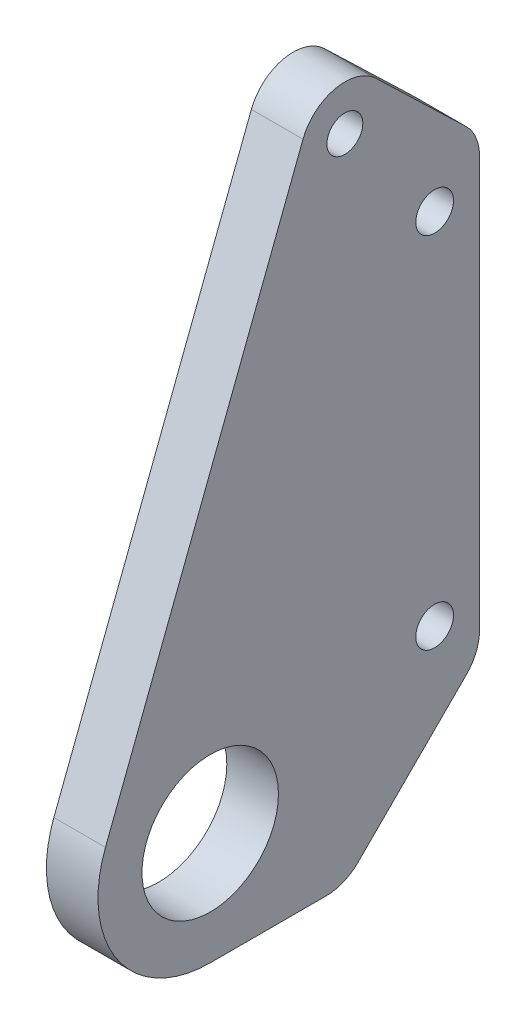
ISO-10303-21;
HEADER;
FILE_DESCRIPTION(('STEP AP214'),'2;1');
FILE_NAME('part.step','',(''),(''),'','','');
FILE_SCHEMA(('AUTOMOTIVE_DESIGN { 1 0 10303 214 1 1 1 1 }'));
ENDSEC;
DATA;
#1=APPLICATION_CONTEXT('core data for automotive mechanical design processes');
#2=APPLICATION_PROTOCOL_DEFINITION('international standard','automotive_design',2000,#1);
#3=PRODUCT_CONTEXT('',#1,'mechanical');
#4=PRODUCT('Part','Part','',(#3));
#5=PRODUCT_RELATED_PRODUCT_CATEGORY('part','',(#4));
#6=PRODUCT_DEFINITION_FORMATION('','',#4);
#7=PRODUCT_DEFINITION_CONTEXT('part definition',#1,'design');
#8=PRODUCT_DEFINITION('design','',#6,#7);
#9=PRODUCT_DEFINITION_SHAPE('','',#8);
#10=(LENGTH_UNIT() NAMED_UNIT(*) SI_UNIT(.MILLI.,.METRE.));
#11=(NAMED_UNIT(*) PLANE_ANGLE_UNIT() SI_UNIT($,.RADIAN.));
#12=(NAMED_UNIT(*) SI_UNIT($,.STERADIAN.) SOLID_ANGLE_UNIT());
#13=UNCERTAINTY_MEASURE_WITH_UNIT(LENGTH_MEASURE(1.E-05),#10,'distance_accuracy_value','');
#14=(GEOMETRIC_REPRESENTATION_CONTEXT(3) GLOBAL_UNCERTAINTY_ASSIGNED_CONTEXT((#13)) GLOBAL_UNIT_ASSIGNED_CONTEXT((#10,
#11,#12)) REPRESENTATION_CONTEXT('',''));
#15=CARTESIAN_POINT('',(0.,0.,0.));
#16=DIRECTION('',(0.,0.,1.));
#17=DIRECTION('',(1.,0.,0.));
#18=AXIS2_PLACEMENT_3D('',#15,#16,#17);
#19=CARTESIAN_POINT('',(5.75,33.7350017623774,-32.4765264559947));
#20=DIRECTION('',(0.,-0.720416564991047,0.693541615828856));
#21=DIRECTION('',(0.,-0.693541615828856,-0.720416564991047));
#22=AXIS2_PLACEMENT_3D('',#19,#20,#21);
#23=PLANE('',#22);
#24=DIRECTION('',(0.,0.693541615828856,0.720416564991047));
#25=VECTOR('',#24,1.);
#26=CARTESIAN_POINT('',(5.75,33.7350017623774,-32.4765264559947));
#27=LINE('',#26,#25);
#28=CARTESIAN_POINT('',(5.75,66.4751301765597,1.53229192085572));
#29=VERTEX_POINT('',#28);
#30=CARTESIAN_POINT('',(5.75,76.1020828249552,11.5322919208557));
#31=VERTEX_POINT('',#30);
#32=EDGE_CURVE('E114',#29,#31,#27,.T.);
#33=ORIENTED_EDGE('',*,*,#32,.F.);
#34=DIRECTION('',(-1.,0.,0.));
#35=VECTOR('',#34,1.);
#36=CARTESIAN_POINT('',(5.75,66.4751301765597,1.53229192085572));
#37=LINE('',#36,#35);
#38=CARTESIAN_POINT('',(0.,66.4751301765597,1.53229192085572));
#39=VERTEX_POINT('',#38);
#40=EDGE_CURVE('E11',#29,#39,#37,.T.);
#41=ORIENTED_EDGE('',*,*,#40,.T.);
#42=DIRECTION('',(0.,0.693541615828856,0.720416564991047));
#43=VECTOR('',#42,1.);
#44=CARTESIAN_POINT('',(0.,33.7350017623774,-32.4765264559947));
#45=LINE('',#44,#43);
#46=CARTESIAN_POINT('',(0.,76.1020828249552,11.5322919208557));
#47=VERTEX_POINT('',#46);
#48=EDGE_CURVE('E138',#39,#47,#45,.T.);
#49=ORIENTED_EDGE('',*,*,#48,.T.);
#50=DIRECTION('',(-1.,0.,0.));
#51=VECTOR('',#50,1.);
#52=CARTESIAN_POINT('',(5.75,76.1020828249552,11.5322919208557));
#53=LINE('',#52,#51);
#54=EDGE_CURVE('E131',#31,#47,#53,.T.);
#55=ORIENTED_EDGE('',*,*,#54,.F.);
#56=EDGE_LOOP('',(#33,#41,#49,#55));
#57=FACE_BOUND('',#56,.T.);
#58=ADVANCED_FACE('F37',(#57),#23,.F.);
#59=CARTESIAN_POINT('',(5.75,72.5,15.));
#60=DIRECTION('',(-1.,0.,0.));
#61=DIRECTION('',(0.,0.,1.));
#62=AXIS2_PLACEMENT_3D('',#59,#60,#61);
#63=CYLINDRICAL_SURFACE('',#62,5.);
#64=CARTESIAN_POINT('',(0.,72.5,15.));
#65=DIRECTION('',(1.,0.,0.));
#66=DIRECTION('',(0.,0.,-1.));
#67=AXIS2_PLACEMENT_3D('',#64,#65,#66);
#68=CIRCLE('',#67,5.);
#69=CARTESIAN_POINT('',(0.,74.2919636429224,19.6678545716897));
#70=VERTEX_POINT('',#69);
#71=EDGE_CURVE('E209',#47,#70,#68,.T.);
#72=ORIENTED_EDGE('',*,*,#71,.T.);
#73=DIRECTION('',(-1.,0.,0.));
#74=VECTOR('',#73,1.);
#75=CARTESIAN_POINT('',(5.75,74.2919636429224,19.6678545716897));
#76=LINE('',#75,#74);
#77=CARTESIAN_POINT('',(5.75,74.2919636429224,19.6678545716897));
#78=VERTEX_POINT('',#77);
#79=EDGE_CURVE('E133',#78,#70,#76,.T.);
#80=ORIENTED_EDGE('',*,*,#79,.F.);
#81=CARTESIAN_POINT('',(5.75,72.5,15.));
#82=DIRECTION('',(1.,0.,0.));
#83=DIRECTION('',(0.,0.,-1.));
#84=AXIS2_PLACEMENT_3D('',#81,#82,#83);
#85=CIRCLE('',#84,5.);
#86=EDGE_CURVE('E119',#31,#78,#85,.T.);
#87=ORIENTED_EDGE('',*,*,#86,.F.);
#88=ORIENTED_EDGE('',*,*,#54,.T.);
#89=EDGE_LOOP('',(#72,#80,#87,#88));
#90=FACE_BOUND('',#89,.T.);
#91=ADVANCED_FACE('F130',(#90),#63,.T.);
#92=CARTESIAN_POINT('',(5.75,16.1230267755844,41.9985888336158));
#93=DIRECTION('',(0.,-0.358392728584483,-0.933570914337935));
#94=DIRECTION('',(0.,0.933570914337935,-0.358392728584483));
#95=AXIS2_PLACEMENT_3D('',#92,#93,#94);
#96=PLANE('',#95);
#97=DIRECTION('',(0.,-0.933570914337935,0.358392728584484));
#98=VECTOR('',#97,1.);
#99=CARTESIAN_POINT('',(0.,16.1230267755844,41.9985888336158));
#100=LINE('',#99,#98);
#101=CARTESIAN_POINT('',(0.,16.979909107306,41.6696364292242));
#102=VERTEX_POINT('',#101);
#103=EDGE_CURVE('E206',#70,#102,#100,.T.);
#104=ORIENTED_EDGE('',*,*,#103,.T.);
#105=DIRECTION('',(-1.,0.,0.));
#106=VECTOR('',#105,1.);
#107=CARTESIAN_POINT('',(5.75,16.979909107306,41.6696364292242));
#108=LINE('',#107,#106);
#109=CARTESIAN_POINT('',(5.75,16.979909107306,41.6696364292242));
#110=VERTEX_POINT('',#109);
#111=EDGE_CURVE('E144',#110,#102,#108,.T.);
#112=ORIENTED_EDGE('',*,*,#111,.F.);
#113=DIRECTION('',(0.,-0.933570914337935,0.358392728584484));
#114=VECTOR('',#113,1.);
#115=CARTESIAN_POINT('',(5.75,16.1230267755844,41.9985888336158));
#116=LINE('',#115,#114);
#117=EDGE_CURVE('E135',#78,#110,#116,.T.);
#118=ORIENTED_EDGE('',*,*,#117,.F.);
#119=ORIENTED_EDGE('',*,*,#79,.T.);
#120=EDGE_LOOP('',(#104,#112,#118,#119));
#121=FACE_BOUND('',#120,.T.);
#122=ADVANCED_FACE('F232',(#121),#96,.F.);
#123=CARTESIAN_POINT('',(5.75,12.5,30.));
#124=DIRECTION('',(-1.,0.,0.));
#125=DIRECTION('',(0.,0.,1.));
#126=AXIS2_PLACEMENT_3D('',#123,#124,#125);
#127=CYLINDRICAL_SURFACE('',#126,12.5);
#128=CARTESIAN_POINT('',(0.,12.5,30.));
#129=DIRECTION('',(1.,0.,0.));
#130=DIRECTION('',(0.,0.,-1.));
#131=AXIS2_PLACEMENT_3D('',#128,#129,#130);
#132=CIRCLE('',#131,12.5);
#133=CARTESIAN_POINT('',(0.,0.,30.));
#134=VERTEX_POINT('',#133);
#135=EDGE_CURVE('E201',#102,#134,#132,.T.);
#136=ORIENTED_EDGE('',*,*,#135,.T.);
#137=DIRECTION('',(-1.,0.,0.));
#138=VECTOR('',#137,1.);
#139=CARTESIAN_POINT('',(5.75,0.,30.));
#140=LINE('',#139,#138);
#141=CARTESIAN_POINT('',(5.75,0.,30.));
#142=VERTEX_POINT('',#141);
#143=EDGE_CURVE('E191',#142,#134,#140,.T.);
#144=ORIENTED_EDGE('',*,*,#143,.F.);
#145=CARTESIAN_POINT('',(5.75,12.5,30.));
#146=DIRECTION('',(1.,0.,0.));
#147=DIRECTION('',(0.,0.,-1.));
#148=AXIS2_PLACEMENT_3D('',#145,#146,#147);
#149=CIRCLE('',#148,12.5);
#150=EDGE_CURVE('E202',#110,#142,#149,.T.);
#151=ORIENTED_EDGE('',*,*,#150,.F.);
#152=ORIENTED_EDGE('',*,*,#111,.T.);
#153=EDGE_LOOP('',(#136,#144,#151,#152));
#154=FACE_BOUND('',#153,.T.);
#155=ADVANCED_FACE('F199',(#154),#127,.T.);
#156=CARTESIAN_POINT('',(5.75,0.,0.));
#157=DIRECTION('',(0.,1.,0.));
#158=DIRECTION('',(0.,0.,1.));
#159=AXIS2_PLACEMENT_3D('',#156,#157,#158);
#160=PLANE('',#159);
#161=DIRECTION('',(0.,0.,-1.));
#162=VECTOR('',#161,1.);
#163=CARTESIAN_POINT('',(0.,0.,0.));
#164=LINE('',#163,#162);
#165=CARTESIAN_POINT('',(0.,0.,17.0710678118656));
#166=VERTEX_POINT('',#165);
#167=EDGE_CURVE('E180',#134,#166,#164,.T.);
#168=ORIENTED_EDGE('',*,*,#167,.T.);
#169=DIRECTION('',(-1.,0.,0.));
#170=VECTOR('',#169,1.);
#171=CARTESIAN_POINT('',(5.75,0.,17.0710678118656));
#172=LINE('',#171,#170);
#173=CARTESIAN_POINT('',(5.75,0.,17.0710678118656));
#174=VERTEX_POINT('',#173);
#175=EDGE_CURVE('E156',#166,#174,#172,.F.);
#176=ORIENTED_EDGE('',*,*,#175,.T.);
#177=DIRECTION('',(0.,0.,-1.));
#178=VECTOR('',#177,1.);
#179=CARTESIAN_POINT('',(5.75,0.,0.));
#180=LINE('',#179,#178);
#181=EDGE_CURVE('E229',#142,#174,#180,.T.);
#182=ORIENTED_EDGE('',*,*,#181,.F.);
#183=ORIENTED_EDGE('',*,*,#143,.T.);
#184=EDGE_LOOP('',(#168,#176,#182,#183));
#185=FACE_BOUND('',#184,.T.);
#186=ADVANCED_FACE('F239',(#185),#160,.F.);
#187=CARTESIAN_POINT('',(5.75,7.50000000000008,7.5));
#188=DIRECTION('',(0.,-0.707106781186551,-0.707106781186544));
#189=DIRECTION('',(0.,0.707106781186544,-0.707106781186551));
#190=AXIS2_PLACEMENT_3D('',#187,#188,#189);
#191=PLANE('',#190);
#192=DIRECTION('',(0.,-0.707106781186544,0.707106781186551));
#193=VECTOR('',#192,1.);
#194=CARTESIAN_POINT('',(5.75,7.50000000000008,7.5));
#195=LINE('',#194,#193);
#196=CARTESIAN_POINT('',(5.75,13.5355339059327,1.46446609406728));
#197=VERTEX_POINT('',#196);
#198=CARTESIAN_POINT('',(5.75,1.46446609406724,13.5355339059329));
#199=VERTEX_POINT('',#198);
#200=EDGE_CURVE('E226',#197,#199,#195,.T.);
#201=ORIENTED_EDGE('',*,*,#200,.T.);
#202=DIRECTION('',(-1.,0.,0.));
#203=VECTOR('',#202,1.);
#204=CARTESIAN_POINT('',(0.,1.46446609406724,13.5355339059329));
#205=LINE('',#204,#203);
#206=CARTESIAN_POINT('',(0.,1.46446609406724,13.5355339059329));
#207=VERTEX_POINT('',#206);
#208=EDGE_CURVE('E142',#199,#207,#205,.T.);
#209=ORIENTED_EDGE('',*,*,#208,.T.);
#210=DIRECTION('',(0.,-0.707106781186544,0.707106781186551));
#211=VECTOR('',#210,1.);
#212=CARTESIAN_POINT('',(0.,7.50000000000008,7.5));
#213=LINE('',#212,#211);
#214=CARTESIAN_POINT('',(0.,13.5355339059327,1.46446609406728));
#215=VERTEX_POINT('',#214);
#216=EDGE_CURVE('E175',#215,#207,#213,.T.);
#217=ORIENTED_EDGE('',*,*,#216,.F.);
#218=DIRECTION('',(-1.,0.,0.));
#219=VECTOR('',#218,1.);
#220=CARTESIAN_POINT('',(5.75,13.5355339059327,1.46446609406728));
#221=LINE('',#220,#219);
#222=EDGE_CURVE('E140',#215,#197,#221,.F.);
#223=ORIENTED_EDGE('',*,*,#222,.T.);
#224=EDGE_LOOP('',(#201,#209,#217,#223));
#225=FACE_BOUND('',#224,.T.);
#226=ADVANCED_FACE('F258',(#225),#191,.T.);
#227=CARTESIAN_POINT('',(5.75,20.,5.));
#228=DIRECTION('',(-1.,0.,0.));
#229=DIRECTION('',(0.,0.,1.));
#230=AXIS2_PLACEMENT_3D('',#227,#228,#229);
#231=CYLINDRICAL_SURFACE('',#230,2.1);
#232=CARTESIAN_POINT('',(5.75,20.,5.));
#233=DIRECTION('',(1.,0.,0.));
#234=DIRECTION('',(0.,0.,-1.));
#235=AXIS2_PLACEMENT_3D('',#232,#233,#234);
#236=CIRCLE('',#235,2.1);
#237=CARTESIAN_POINT('',(5.75,20.,2.9));
#238=VERTEX_POINT('',#237);
#239=EDGE_CURVE('E216',#238,#238,#236,.T.);
#240=ORIENTED_EDGE('',*,*,#239,.T.);
#241=EDGE_LOOP('',(#240));
#242=FACE_BOUND('',#241,.T.);
#243=CARTESIAN_POINT('',(0.,20.,5.));
#244=DIRECTION('',(1.,0.,0.));
#245=DIRECTION('',(0.,0.,-1.));
#246=AXIS2_PLACEMENT_3D('',#243,#244,#245);
#247=CIRCLE('',#246,2.1);
#248=CARTESIAN_POINT('',(0.,20.,2.9));
#249=VERTEX_POINT('',#248);
#250=EDGE_CURVE('E186',#249,#249,#247,.T.);
#251=ORIENTED_EDGE('',*,*,#250,.F.);
#252=EDGE_LOOP('',(#251));
#253=FACE_BOUND('',#252,.T.);
#254=ADVANCED_FACE('F269',(#242,#253),#231,.F.);
#255=CARTESIAN_POINT('',(5.75,60.,5.));
#256=DIRECTION('',(-1.,0.,0.));
#257=DIRECTION('',(0.,0.,1.));
#258=AXIS2_PLACEMENT_3D('',#255,#256,#257);
#259=CYLINDRICAL_SURFACE('',#258,2.1);
#260=CARTESIAN_POINT('',(5.75,60.,5.));
#261=DIRECTION('',(1.,0.,0.));
#262=DIRECTION('',(0.,0.,-1.));
#263=AXIS2_PLACEMENT_3D('',#260,#261,#262);
#264=CIRCLE('',#263,2.1);
#265=CARTESIAN_POINT('',(5.75,60.,2.90000000000001));
#266=VERTEX_POINT('',#265);
#267=EDGE_CURVE('E219',#266,#266,#264,.T.);
#268=ORIENTED_EDGE('',*,*,#267,.T.);
#269=EDGE_LOOP('',(#268));
#270=FACE_BOUND('',#269,.T.);
#271=CARTESIAN_POINT('',(0.,60.,5.));
#272=DIRECTION('',(1.,0.,0.));
#273=DIRECTION('',(0.,0.,-1.));
#274=AXIS2_PLACEMENT_3D('',#271,#272,#273);
#275=CIRCLE('',#274,2.1);
#276=CARTESIAN_POINT('',(0.,60.,2.90000000000001));
#277=VERTEX_POINT('',#276);
#278=EDGE_CURVE('E178',#277,#277,#275,.T.);
#279=ORIENTED_EDGE('',*,*,#278,.F.);
#280=EDGE_LOOP('',(#279));
#281=FACE_BOUND('',#280,.T.);
#282=ADVANCED_FACE('F278',(#270,#281),#259,.F.);
#283=CARTESIAN_POINT('',(5.75,12.5,30.));
#284=DIRECTION('',(-1.,0.,0.));
#285=DIRECTION('',(0.,0.,1.));
#286=AXIS2_PLACEMENT_3D('',#283,#284,#285);
#287=CYLINDRICAL_SURFACE('',#286,7.59999999999999);
#288=CARTESIAN_POINT('',(5.75,12.5,30.));
#289=DIRECTION('',(1.,0.,0.));
#290=DIRECTION('',(0.,0.,-1.));
#291=AXIS2_PLACEMENT_3D('',#288,#289,#290);
#292=CIRCLE('',#291,7.59999999999999);
#293=CARTESIAN_POINT('',(5.75,12.5,22.4));
#294=VERTEX_POINT('',#293);
#295=EDGE_CURVE('E222',#294,#294,#292,.T.);
#296=ORIENTED_EDGE('',*,*,#295,.T.);
#297=EDGE_LOOP('',(#296));
#298=FACE_BOUND('',#297,.T.);
#299=CARTESIAN_POINT('',(0.,12.5,30.));
#300=DIRECTION('',(1.,0.,0.));
#301=DIRECTION('',(0.,0.,-1.));
#302=AXIS2_PLACEMENT_3D('',#299,#300,#301);
#303=CIRCLE('',#302,7.59999999999999);
#304=CARTESIAN_POINT('',(0.,12.5,22.4));
#305=VERTEX_POINT('',#304);
#306=EDGE_CURVE('E174',#305,#305,#303,.T.);
#307=ORIENTED_EDGE('',*,*,#306,.F.);
#308=EDGE_LOOP('',(#307));
#309=FACE_BOUND('',#308,.T.);
#310=ADVANCED_FACE('F275',(#298,#309),#287,.F.);
#311=CARTESIAN_POINT('',(5.75,0.,0.));
#312=DIRECTION('',(0.,0.,1.));
#313=DIRECTION('',(0.,-1.,0.));
#314=AXIS2_PLACEMENT_3D('',#311,#312,#313);
#315=PLANE('',#314);
#316=DIRECTION('',(0.,1.,0.));
#317=VECTOR('',#316,1.);
#318=CARTESIAN_POINT('',(5.75,0.,0.));
#319=LINE('',#318,#317);
#320=CARTESIAN_POINT('',(5.75,17.0710678118655,0.));
#321=VERTEX_POINT('',#320);
#322=CARTESIAN_POINT('',(5.75,62.8730473516045,0.));
#323=VERTEX_POINT('',#322);
#324=EDGE_CURVE('E167',#321,#323,#319,.T.);
#325=ORIENTED_EDGE('',*,*,#324,.F.);
#326=DIRECTION('',(-1.,0.,0.));
#327=VECTOR('',#326,1.);
#328=CARTESIAN_POINT('',(0.,17.0710678118655,0.));
#329=LINE('',#328,#327);
#330=CARTESIAN_POINT('',(0.,17.0710678118655,0.));
#331=VERTEX_POINT('',#330);
#332=EDGE_CURVE('E45',#321,#331,#329,.T.);
#333=ORIENTED_EDGE('',*,*,#332,.T.);
#334=DIRECTION('',(0.,1.,0.));
#335=VECTOR('',#334,1.);
#336=CARTESIAN_POINT('',(0.,0.,0.));
#337=LINE('',#336,#335);
#338=CARTESIAN_POINT('',(0.,62.8730473516045,0.));
#339=VERTEX_POINT('',#338);
#340=EDGE_CURVE('E166',#331,#339,#337,.T.);
#341=ORIENTED_EDGE('',*,*,#340,.T.);
#342=DIRECTION('',(-1.,0.,0.));
#343=VECTOR('',#342,1.);
#344=CARTESIAN_POINT('',(5.75,62.8730473516045,0.));
#345=LINE('',#344,#343);
#346=EDGE_CURVE('E52',#339,#323,#345,.F.);
#347=ORIENTED_EDGE('',*,*,#346,.T.);
#348=EDGE_LOOP('',(#325,#333,#341,#347));
#349=FACE_BOUND('',#348,.T.);
#350=ADVANCED_FACE('F165',(#349),#315,.F.);
#351=CARTESIAN_POINT('',(5.75,72.5,15.));
#352=DIRECTION('',(-1.,0.,0.));
#353=DIRECTION('',(0.,0.,1.));
#354=AXIS2_PLACEMENT_3D('',#351,#352,#353);
#355=CYLINDRICAL_SURFACE('',#354,2.);
#356=CARTESIAN_POINT('',(5.75,72.5,15.));
#357=DIRECTION('',(1.,0.,0.));
#358=DIRECTION('',(0.,0.,-1.));
#359=AXIS2_PLACEMENT_3D('',#356,#357,#358);
#360=CIRCLE('',#359,2.);
#361=CARTESIAN_POINT('',(5.75,72.5,13.));
#362=VERTEX_POINT('',#361);
#363=EDGE_CURVE('E193',#362,#362,#360,.T.);
#364=ORIENTED_EDGE('',*,*,#363,.T.);
#365=EDGE_LOOP('',(#364));
#366=FACE_BOUND('',#365,.T.);
#367=CARTESIAN_POINT('',(0.,72.5,15.));
#368=DIRECTION('',(1.,0.,0.));
#369=DIRECTION('',(0.,0.,-1.));
#370=AXIS2_PLACEMENT_3D('',#367,#368,#369);
#371=CIRCLE('',#370,2.);
#372=CARTESIAN_POINT('',(0.,72.5,13.));
#373=VERTEX_POINT('',#372);
#374=EDGE_CURVE('E126',#373,#373,#371,.T.);
#375=ORIENTED_EDGE('',*,*,#374,.F.);
#376=EDGE_LOOP('',(#375));
#377=FACE_BOUND('',#376,.T.);
#378=ADVANCED_FACE('F274',(#366,#377),#355,.F.);
#379=CARTESIAN_POINT('',(5.75,0.,0.));
#380=DIRECTION('',(1.,0.,0.));
#381=DIRECTION('',(0.,0.,-1.));
#382=AXIS2_PLACEMENT_3D('',#379,#380,#381);
#383=PLANE('',#382);
#384=ORIENTED_EDGE('',*,*,#181,.T.);
#385=CARTESIAN_POINT('',(5.75,5.,17.0710678118656));
#386=DIRECTION('',(1.,0.,0.));
#387=DIRECTION('',(0.,0.,-1.));
#388=AXIS2_PLACEMENT_3D('',#385,#386,#387);
#389=CIRCLE('',#388,5.);
#390=EDGE_CURVE('E160',#174,#199,#389,.T.);
#391=ORIENTED_EDGE('',*,*,#390,.T.);
#392=ORIENTED_EDGE('',*,*,#200,.F.);
#393=CARTESIAN_POINT('',(5.75,17.0710678118655,5.));
#394=DIRECTION('',(1.,0.,0.));
#395=DIRECTION('',(0.,0.,-1.));
#396=AXIS2_PLACEMENT_3D('',#393,#394,#395);
#397=CIRCLE('',#396,5.);
#398=EDGE_CURVE('E59',#197,#321,#397,.T.);
#399=ORIENTED_EDGE('',*,*,#398,.T.);
#400=ORIENTED_EDGE('',*,*,#324,.T.);
#401=CARTESIAN_POINT('',(5.75,62.8730473516045,5.));
#402=DIRECTION('',(1.,0.,0.));
#403=DIRECTION('',(0.,0.,-1.));
#404=AXIS2_PLACEMENT_3D('',#401,#402,#403);
#405=CIRCLE('',#404,5.);
#406=EDGE_CURVE('E122',#323,#29,#405,.T.);
#407=ORIENTED_EDGE('',*,*,#406,.T.);
#408=ORIENTED_EDGE('',*,*,#32,.T.);
#409=ORIENTED_EDGE('',*,*,#86,.T.);
#410=ORIENTED_EDGE('',*,*,#117,.T.);
#411=ORIENTED_EDGE('',*,*,#150,.T.);
#412=EDGE_LOOP('',(#384,#391,#392,#399,#400,#407,#408,#409,#410,#411));
#413=FACE_BOUND('',#412,.T.);
#414=ORIENTED_EDGE('',*,*,#295,.F.);
#415=EDGE_LOOP('',(#414));
#416=FACE_BOUND('',#415,.T.);
#417=ORIENTED_EDGE('',*,*,#267,.F.);
#418=EDGE_LOOP('',(#417));
#419=FACE_BOUND('',#418,.T.);
#420=ORIENTED_EDGE('',*,*,#239,.F.);
#421=EDGE_LOOP('',(#420));
#422=FACE_BOUND('',#421,.T.);
#423=ORIENTED_EDGE('',*,*,#363,.F.);
#424=EDGE_LOOP('',(#423));
#425=FACE_BOUND('',#424,.T.);
#426=ADVANCED_FACE('F117',(#413,#416,#419,#422,#425),#383,.T.);
#427=CARTESIAN_POINT('',(0.,0.,0.));
#428=DIRECTION('',(1.,0.,0.));
#429=DIRECTION('',(0.,0.,-1.));
#430=AXIS2_PLACEMENT_3D('',#427,#428,#429);
#431=PLANE('',#430);
#432=ORIENTED_EDGE('',*,*,#216,.T.);
#433=CARTESIAN_POINT('',(0.,5.,17.0710678118656));
#434=DIRECTION('',(1.,0.,0.));
#435=DIRECTION('',(0.,0.,-1.));
#436=AXIS2_PLACEMENT_3D('',#433,#434,#435);
#437=CIRCLE('',#436,5.);
#438=EDGE_CURVE('E154',#207,#166,#437,.F.);
#439=ORIENTED_EDGE('',*,*,#438,.T.);
#440=ORIENTED_EDGE('',*,*,#167,.F.);
#441=ORIENTED_EDGE('',*,*,#135,.F.);
#442=ORIENTED_EDGE('',*,*,#103,.F.);
#443=ORIENTED_EDGE('',*,*,#71,.F.);
#444=ORIENTED_EDGE('',*,*,#48,.F.);
#445=CARTESIAN_POINT('',(0.,62.8730473516045,5.));
#446=DIRECTION('',(1.,0.,0.));
#447=DIRECTION('',(0.,0.,-1.));
#448=AXIS2_PLACEMENT_3D('',#445,#446,#447);
#449=CIRCLE('',#448,5.);
#450=EDGE_CURVE('E150',#39,#339,#449,.F.);
#451=ORIENTED_EDGE('',*,*,#450,.T.);
#452=ORIENTED_EDGE('',*,*,#340,.F.);
#453=CARTESIAN_POINT('',(0.,17.0710678118655,5.));
#454=DIRECTION('',(1.,0.,0.));
#455=DIRECTION('',(0.,0.,-1.));
#456=AXIS2_PLACEMENT_3D('',#453,#454,#455);
#457=CIRCLE('',#456,5.);
#458=EDGE_CURVE('E152',#331,#215,#457,.F.);
#459=ORIENTED_EDGE('',*,*,#458,.T.);
#460=EDGE_LOOP('',(#432,#439,#440,#441,#442,#443,#444,#451,#452,#459));
#461=FACE_BOUND('',#460,.T.);
#462=ORIENTED_EDGE('',*,*,#306,.T.);
#463=EDGE_LOOP('',(#462));
#464=FACE_BOUND('',#463,.T.);
#465=ORIENTED_EDGE('',*,*,#278,.T.);
#466=EDGE_LOOP('',(#465));
#467=FACE_BOUND('',#466,.T.);
#468=ORIENTED_EDGE('',*,*,#250,.T.);
#469=EDGE_LOOP('',(#468));
#470=FACE_BOUND('',#469,.T.);
#471=ORIENTED_EDGE('',*,*,#374,.T.);
#472=EDGE_LOOP('',(#471));
#473=FACE_BOUND('',#472,.T.);
#474=ADVANCED_FACE('F171',(#461,#464,#467,#470,#473),#431,.F.);
#475=CARTESIAN_POINT('',(5.75,5.,17.0710678118656));
#476=DIRECTION('',(1.,0.,0.));
#477=DIRECTION('',(0.,0.,-1.));
#478=AXIS2_PLACEMENT_3D('',#475,#476,#477);
#479=CYLINDRICAL_SURFACE('',#478,5.);
#480=ORIENTED_EDGE('',*,*,#390,.F.);
#481=ORIENTED_EDGE('',*,*,#175,.F.);
#482=ORIENTED_EDGE('',*,*,#438,.F.);
#483=ORIENTED_EDGE('',*,*,#208,.F.);
#484=EDGE_LOOP('',(#480,#481,#482,#483));
#485=FACE_BOUND('',#484,.T.);
#486=ADVANCED_FACE('F247',(#485),#479,.T.);
#487=CARTESIAN_POINT('',(5.75,17.0710678118655,5.));
#488=DIRECTION('',(1.,0.,0.));
#489=DIRECTION('',(0.,0.,-1.));
#490=AXIS2_PLACEMENT_3D('',#487,#488,#489);
#491=CYLINDRICAL_SURFACE('',#490,5.);
#492=ORIENTED_EDGE('',*,*,#398,.F.);
#493=ORIENTED_EDGE('',*,*,#222,.F.);
#494=ORIENTED_EDGE('',*,*,#458,.F.);
#495=ORIENTED_EDGE('',*,*,#332,.F.);
#496=EDGE_LOOP('',(#492,#493,#494,#495));
#497=FACE_BOUND('',#496,.T.);
#498=ADVANCED_FACE('F249',(#497),#491,.T.);
#499=CARTESIAN_POINT('',(5.75,62.8730473516045,5.));
#500=DIRECTION('',(-1.,0.,0.));
#501=DIRECTION('',(0.,0.,1.));
#502=AXIS2_PLACEMENT_3D('',#499,#500,#501);
#503=CYLINDRICAL_SURFACE('',#502,5.);
#504=ORIENTED_EDGE('',*,*,#406,.F.);
#505=ORIENTED_EDGE('',*,*,#346,.F.);
#506=ORIENTED_EDGE('',*,*,#450,.F.);
#507=ORIENTED_EDGE('',*,*,#40,.F.);
#508=EDGE_LOOP('',(#504,#505,#506,#507));
#509=FACE_BOUND('',#508,.T.);
#510=ADVANCED_FACE('F39',(#509),#503,.T.);
#511=CLOSED_SHELL('',(#58,#91,#122,#155,#186,#226,#254,#282,#310,#350,#378,#426,#474,#486,#498,#510));
#512=MANIFOLD_SOLID_BREP('B2',#511);
#513=ADVANCED_BREP_SHAPE_REPRESENTATION('',(#18,#512),#14);
#514=SHAPE_DEFINITION_REPRESENTATION(#9,#513);
ENDSEC;
END-ISO-10303-21;
